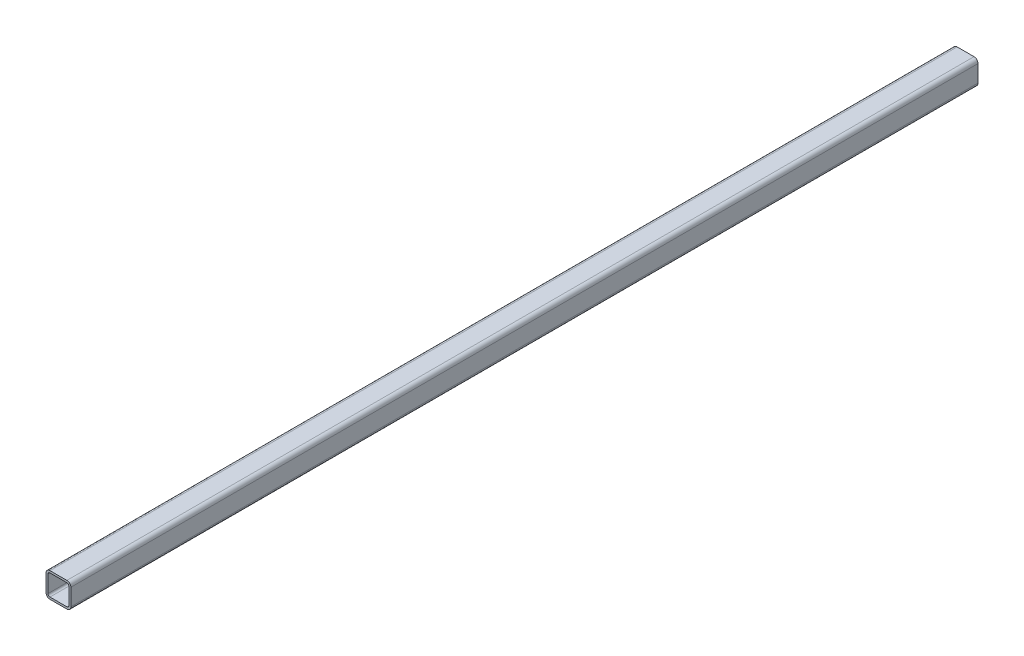
ISO-10303-21;
HEADER;
FILE_DESCRIPTION(('STEP AP214'),'2;1');
FILE_NAME('part.step','',(''),(''),'','','');
FILE_SCHEMA(('AUTOMOTIVE_DESIGN { 1 0 10303 214 1 1 1 1 }'));
ENDSEC;
DATA;
#1=APPLICATION_CONTEXT('core data for automotive mechanical design processes');
#2=APPLICATION_PROTOCOL_DEFINITION('international standard','automotive_design',2000,#1);
#3=PRODUCT_CONTEXT('',#1,'mechanical');
#4=PRODUCT('Part','Part','',(#3));
#5=PRODUCT_RELATED_PRODUCT_CATEGORY('part','',(#4));
#6=PRODUCT_DEFINITION_FORMATION('','',#4);
#7=PRODUCT_DEFINITION_CONTEXT('part definition',#1,'design');
#8=PRODUCT_DEFINITION('design','',#6,#7);
#9=PRODUCT_DEFINITION_SHAPE('','',#8);
#10=(LENGTH_UNIT() NAMED_UNIT(*) SI_UNIT(.MILLI.,.METRE.));
#11=(NAMED_UNIT(*) PLANE_ANGLE_UNIT() SI_UNIT($,.RADIAN.));
#12=(NAMED_UNIT(*) SI_UNIT($,.STERADIAN.) SOLID_ANGLE_UNIT());
#13=UNCERTAINTY_MEASURE_WITH_UNIT(LENGTH_MEASURE(1.E-05),#10,'distance_accuracy_value','');
#14=(GEOMETRIC_REPRESENTATION_CONTEXT(3) GLOBAL_UNCERTAINTY_ASSIGNED_CONTEXT((#13)) GLOBAL_UNIT_ASSIGNED_CONTEXT((#10,
#11,#12)) REPRESENTATION_CONTEXT('',''));
#15=CARTESIAN_POINT('',(0.,0.,0.));
#16=DIRECTION('',(0.,0.,1.));
#17=DIRECTION('',(1.,0.,0.));
#18=AXIS2_PLACEMENT_3D('',#15,#16,#17);
#19=CARTESIAN_POINT('',(933.6,923.6,-880.));
#20=DIRECTION('',(0.,0.,1.));
#21=DIRECTION('',(1.,0.,0.));
#22=AXIS2_PLACEMENT_3D('',#19,#20,#21);
#23=CYLINDRICAL_SURFACE('',#22,6.39999999999996);
#24=CARTESIAN_POINT('',(933.6,923.6,600.));
#25=DIRECTION('',(0.,0.,1.));
#26=DIRECTION('',(1.,0.,0.));
#27=AXIS2_PLACEMENT_3D('',#24,#25,#26);
#28=CIRCLE('',#27,6.39999999999996);
#29=CARTESIAN_POINT('',(940.,923.6,600.));
#30=VERTEX_POINT('',#29);
#31=CARTESIAN_POINT('',(933.6,930.,600.));
#32=VERTEX_POINT('',#31);
#33=EDGE_CURVE('E234',#30,#32,#28,.T.);
#34=ORIENTED_EDGE('',*,*,#33,.F.);
#35=DIRECTION('',(0.,0.,1.));
#36=VECTOR('',#35,1.);
#37=CARTESIAN_POINT('',(940.,923.6,-880.));
#38=LINE('',#37,#36);
#39=CARTESIAN_POINT('',(940.,923.6,-860.));
#40=VERTEX_POINT('',#39);
#41=EDGE_CURVE('E137',#30,#40,#38,.F.);
#42=ORIENTED_EDGE('',*,*,#41,.T.);
#43=CARTESIAN_POINT('',(933.6,923.6,-860.));
#44=DIRECTION('',(0.,0.,1.));
#45=DIRECTION('',(1.,0.,0.));
#46=AXIS2_PLACEMENT_3D('',#43,#44,#45);
#47=CIRCLE('',#46,6.39999999999996);
#48=CARTESIAN_POINT('',(933.6,930.,-860.));
#49=VERTEX_POINT('',#48);
#50=EDGE_CURVE('E251',#49,#40,#47,.F.);
#51=ORIENTED_EDGE('',*,*,#50,.F.);
#52=DIRECTION('',(0.,0.,-1.));
#53=VECTOR('',#52,1.);
#54=CARTESIAN_POINT('',(933.6,930.,-880.));
#55=LINE('',#54,#53);
#56=EDGE_CURVE('E208',#49,#32,#55,.F.);
#57=ORIENTED_EDGE('',*,*,#56,.T.);
#58=EDGE_LOOP('',(#34,#42,#51,#57));
#59=FACE_BOUND('',#58,.T.);
#60=ADVANCED_FACE('F19',(#59),#23,.T.);
#61=CARTESIAN_POINT('',(906.4,930.,-880.));
#62=DIRECTION('',(0.,-1.,0.));
#63=DIRECTION('',(0.,0.,-1.));
#64=AXIS2_PLACEMENT_3D('',#61,#62,#63);
#65=PLANE('',#64);
#66=DIRECTION('',(-1.,0.,0.));
#67=VECTOR('',#66,1.);
#68=CARTESIAN_POINT('',(-1180.,930.,-860.));
#69=LINE('',#68,#67);
#70=CARTESIAN_POINT('',(906.4,930.,-860.));
#71=VERTEX_POINT('',#70);
#72=EDGE_CURVE('E182',#71,#49,#69,.F.);
#73=ORIENTED_EDGE('',*,*,#72,.F.);
#74=DIRECTION('',(0.,0.,1.));
#75=VECTOR('',#74,1.);
#76=CARTESIAN_POINT('',(906.4,930.,-880.));
#77=LINE('',#76,#75);
#78=CARTESIAN_POINT('',(906.4,930.,600.));
#79=VERTEX_POINT('',#78);
#80=EDGE_CURVE('E206',#79,#71,#77,.F.);
#81=ORIENTED_EDGE('',*,*,#80,.F.);
#82=DIRECTION('',(1.,0.,0.));
#83=VECTOR('',#82,1.);
#84=CARTESIAN_POINT('',(1180.,930.,600.));
#85=LINE('',#84,#83);
#86=EDGE_CURVE('E233',#32,#79,#85,.F.);
#87=ORIENTED_EDGE('',*,*,#86,.F.);
#88=ORIENTED_EDGE('',*,*,#56,.F.);
#89=EDGE_LOOP('',(#73,#81,#87,#88));
#90=FACE_BOUND('',#89,.T.);
#91=ADVANCED_FACE('F270',(#90),#65,.F.);
#92=CARTESIAN_POINT('',(906.4,923.6,-880.));
#93=DIRECTION('',(0.,0.,1.));
#94=DIRECTION('',(1.,0.,0.));
#95=AXIS2_PLACEMENT_3D('',#92,#93,#94);
#96=CYLINDRICAL_SURFACE('',#95,6.39999999999996);
#97=CARTESIAN_POINT('',(906.4,923.6,600.));
#98=DIRECTION('',(0.,0.,1.));
#99=DIRECTION('',(1.,0.,0.));
#100=AXIS2_PLACEMENT_3D('',#97,#98,#99);
#101=CIRCLE('',#100,6.39999999999996);
#102=CARTESIAN_POINT('',(900.,923.6,600.));
#103=VERTEX_POINT('',#102);
#104=EDGE_CURVE('E230',#79,#103,#101,.T.);
#105=ORIENTED_EDGE('',*,*,#104,.F.);
#106=ORIENTED_EDGE('',*,*,#80,.T.);
#107=CARTESIAN_POINT('',(906.4,923.6,-860.));
#108=DIRECTION('',(0.,0.,1.));
#109=DIRECTION('',(1.,0.,0.));
#110=AXIS2_PLACEMENT_3D('',#107,#108,#109);
#111=CIRCLE('',#110,6.39999999999996);
#112=CARTESIAN_POINT('',(900.,923.6,-860.));
#113=VERTEX_POINT('',#112);
#114=EDGE_CURVE('E181',#113,#71,#111,.F.);
#115=ORIENTED_EDGE('',*,*,#114,.F.);
#116=DIRECTION('',(0.,0.,-1.));
#117=VECTOR('',#116,1.);
#118=CARTESIAN_POINT('',(900.,923.6,-880.));
#119=LINE('',#118,#117);
#120=EDGE_CURVE('E204',#113,#103,#119,.F.);
#121=ORIENTED_EDGE('',*,*,#120,.T.);
#122=EDGE_LOOP('',(#105,#106,#115,#121));
#123=FACE_BOUND('',#122,.T.);
#124=ADVANCED_FACE('F265',(#123),#96,.T.);
#125=CARTESIAN_POINT('',(900.,923.6,-880.));
#126=DIRECTION('',(1.,0.,0.));
#127=DIRECTION('',(0.,0.,-1.));
#128=AXIS2_PLACEMENT_3D('',#125,#126,#127);
#129=PLANE('',#128);
#130=DIRECTION('',(0.,1.,0.));
#131=VECTOR('',#130,1.);
#132=CARTESIAN_POINT('',(900.,923.6,-860.));
#133=LINE('',#132,#131);
#134=CARTESIAN_POINT('',(900.,896.4,-860.));
#135=VERTEX_POINT('',#134);
#136=EDGE_CURVE('E177',#135,#113,#133,.T.);
#137=ORIENTED_EDGE('',*,*,#136,.F.);
#138=DIRECTION('',(0.,0.,1.));
#139=VECTOR('',#138,1.);
#140=CARTESIAN_POINT('',(900.,896.4,-880.));
#141=LINE('',#140,#139);
#142=CARTESIAN_POINT('',(900.,896.4,600.));
#143=VERTEX_POINT('',#142);
#144=EDGE_CURVE('E202',#143,#135,#141,.F.);
#145=ORIENTED_EDGE('',*,*,#144,.F.);
#146=DIRECTION('',(0.,-1.,0.));
#147=VECTOR('',#146,1.);
#148=CARTESIAN_POINT('',(900.,923.6,600.));
#149=LINE('',#148,#147);
#150=EDGE_CURVE('E229',#103,#143,#149,.T.);
#151=ORIENTED_EDGE('',*,*,#150,.F.);
#152=ORIENTED_EDGE('',*,*,#120,.F.);
#153=EDGE_LOOP('',(#137,#145,#151,#152));
#154=FACE_BOUND('',#153,.T.);
#155=ADVANCED_FACE('F261',(#154),#129,.F.);
#156=CARTESIAN_POINT('',(906.4,896.4,-880.));
#157=DIRECTION('',(0.,0.,1.));
#158=DIRECTION('',(1.,0.,0.));
#159=AXIS2_PLACEMENT_3D('',#156,#157,#158);
#160=CYLINDRICAL_SURFACE('',#159,6.40000000000007);
#161=CARTESIAN_POINT('',(906.4,896.4,600.));
#162=DIRECTION('',(0.,0.,1.));
#163=DIRECTION('',(1.,0.,0.));
#164=AXIS2_PLACEMENT_3D('',#161,#162,#163);
#165=CIRCLE('',#164,6.40000000000007);
#166=CARTESIAN_POINT('',(906.4,890.,600.));
#167=VERTEX_POINT('',#166);
#168=EDGE_CURVE('E226',#143,#167,#165,.T.);
#169=ORIENTED_EDGE('',*,*,#168,.F.);
#170=ORIENTED_EDGE('',*,*,#144,.T.);
#171=CARTESIAN_POINT('',(906.4,896.4,-860.));
#172=DIRECTION('',(0.,0.,1.));
#173=DIRECTION('',(1.,0.,0.));
#174=AXIS2_PLACEMENT_3D('',#171,#172,#173);
#175=CIRCLE('',#174,6.40000000000007);
#176=CARTESIAN_POINT('',(906.4,890.,-860.));
#177=VERTEX_POINT('',#176);
#178=EDGE_CURVE('E146',#177,#135,#175,.F.);
#179=ORIENTED_EDGE('',*,*,#178,.F.);
#180=DIRECTION('',(0.,0.,1.));
#181=VECTOR('',#180,1.);
#182=CARTESIAN_POINT('',(906.4,890.,-880.));
#183=LINE('',#182,#181);
#184=EDGE_CURVE('E138',#177,#167,#183,.T.);
#185=ORIENTED_EDGE('',*,*,#184,.T.);
#186=EDGE_LOOP('',(#169,#170,#179,#185));
#187=FACE_BOUND('',#186,.T.);
#188=ADVANCED_FACE('F257',(#187),#160,.T.);
#189=CARTESIAN_POINT('',(933.6,890.,-880.));
#190=DIRECTION('',(0.,1.,0.));
#191=DIRECTION('',(0.,0.,1.));
#192=AXIS2_PLACEMENT_3D('',#189,#190,#191);
#193=PLANE('',#192);
#194=DIRECTION('',(-1.,0.,0.));
#195=VECTOR('',#194,1.);
#196=CARTESIAN_POINT('',(-1180.,890.,-860.));
#197=LINE('',#196,#195);
#198=CARTESIAN_POINT('',(933.6,890.,-860.));
#199=VERTEX_POINT('',#198);
#200=EDGE_CURVE('E141',#199,#177,#197,.T.);
#201=ORIENTED_EDGE('',*,*,#200,.F.);
#202=DIRECTION('',(0.,0.,1.));
#203=VECTOR('',#202,1.);
#204=CARTESIAN_POINT('',(933.6,890.,-880.));
#205=LINE('',#204,#203);
#206=CARTESIAN_POINT('',(933.6,890.,600.));
#207=VERTEX_POINT('',#206);
#208=EDGE_CURVE('E129',#207,#199,#205,.F.);
#209=ORIENTED_EDGE('',*,*,#208,.F.);
#210=DIRECTION('',(1.,0.,0.));
#211=VECTOR('',#210,1.);
#212=CARTESIAN_POINT('',(1180.,890.,600.));
#213=LINE('',#212,#211);
#214=EDGE_CURVE('E225',#167,#207,#213,.T.);
#215=ORIENTED_EDGE('',*,*,#214,.F.);
#216=ORIENTED_EDGE('',*,*,#184,.F.);
#217=EDGE_LOOP('',(#201,#209,#215,#216));
#218=FACE_BOUND('',#217,.T.);
#219=ADVANCED_FACE('F142',(#218),#193,.F.);
#220=CARTESIAN_POINT('',(933.6,896.4,-880.));
#221=DIRECTION('',(0.,0.,1.));
#222=DIRECTION('',(1.,0.,0.));
#223=AXIS2_PLACEMENT_3D('',#220,#221,#222);
#224=CYLINDRICAL_SURFACE('',#223,6.39999999999996);
#225=CARTESIAN_POINT('',(933.6,896.4,600.));
#226=DIRECTION('',(0.,0.,1.));
#227=DIRECTION('',(1.,0.,0.));
#228=AXIS2_PLACEMENT_3D('',#225,#226,#227);
#229=CIRCLE('',#228,6.39999999999996);
#230=CARTESIAN_POINT('',(940.,896.4,600.));
#231=VERTEX_POINT('',#230);
#232=EDGE_CURVE('E133',#207,#231,#229,.T.);
#233=ORIENTED_EDGE('',*,*,#232,.F.);
#234=ORIENTED_EDGE('',*,*,#208,.T.);
#235=CARTESIAN_POINT('',(933.6,896.4,-860.));
#236=DIRECTION('',(0.,0.,1.));
#237=DIRECTION('',(1.,0.,0.));
#238=AXIS2_PLACEMENT_3D('',#235,#236,#237);
#239=CIRCLE('',#238,6.39999999999996);
#240=CARTESIAN_POINT('',(940.,896.4,-860.));
#241=VERTEX_POINT('',#240);
#242=EDGE_CURVE('E22',#241,#199,#239,.F.);
#243=ORIENTED_EDGE('',*,*,#242,.F.);
#244=DIRECTION('',(0.,0.,1.));
#245=VECTOR('',#244,1.);
#246=CARTESIAN_POINT('',(940.,896.4,-880.));
#247=LINE('',#246,#245);
#248=EDGE_CURVE('E195',#241,#231,#247,.T.);
#249=ORIENTED_EDGE('',*,*,#248,.T.);
#250=EDGE_LOOP('',(#233,#234,#243,#249));
#251=FACE_BOUND('',#250,.T.);
#252=ADVANCED_FACE('F131',(#251),#224,.T.);
#253=CARTESIAN_POINT('',(940.,896.4,-880.));
#254=DIRECTION('',(-1.,0.,0.));
#255=DIRECTION('',(0.,0.,1.));
#256=AXIS2_PLACEMENT_3D('',#253,#254,#255);
#257=PLANE('',#256);
#258=DIRECTION('',(0.,1.,0.));
#259=VECTOR('',#258,1.);
#260=CARTESIAN_POINT('',(940.,923.6,-860.));
#261=LINE('',#260,#259);
#262=EDGE_CURVE('E152',#40,#241,#261,.F.);
#263=ORIENTED_EDGE('',*,*,#262,.F.);
#264=ORIENTED_EDGE('',*,*,#41,.F.);
#265=DIRECTION('',(0.,-1.,0.));
#266=VECTOR('',#265,1.);
#267=CARTESIAN_POINT('',(940.,923.6,600.));
#268=LINE('',#267,#266);
#269=EDGE_CURVE('E223',#231,#30,#268,.F.);
#270=ORIENTED_EDGE('',*,*,#269,.F.);
#271=ORIENTED_EDGE('',*,*,#248,.F.);
#272=EDGE_LOOP('',(#263,#264,#270,#271));
#273=FACE_BOUND('',#272,.T.);
#274=ADVANCED_FACE('F277',(#273),#257,.F.);
#275=CARTESIAN_POINT('',(906.4,896.4,-880.));
#276=DIRECTION('',(0.,0.,1.));
#277=DIRECTION('',(1.,0.,0.));
#278=AXIS2_PLACEMENT_3D('',#275,#276,#277);
#279=CYLINDRICAL_SURFACE('',#278,3.19999999999998);
#280=DIRECTION('',(0.,0.,1.));
#281=VECTOR('',#280,1.);
#282=CARTESIAN_POINT('',(906.4,893.2,-880.));
#283=LINE('',#282,#281);
#284=CARTESIAN_POINT('',(906.4,893.2,-860.));
#285=VERTEX_POINT('',#284);
#286=CARTESIAN_POINT('',(906.4,893.2,600.));
#287=VERTEX_POINT('',#286);
#288=EDGE_CURVE('E154',#285,#287,#283,.T.);
#289=ORIENTED_EDGE('',*,*,#288,.F.);
#290=CARTESIAN_POINT('',(906.4,896.4,-860.));
#291=DIRECTION('',(0.,0.,1.));
#292=DIRECTION('',(1.,0.,0.));
#293=AXIS2_PLACEMENT_3D('',#290,#291,#292);
#294=CIRCLE('',#293,3.19999999999998);
#295=CARTESIAN_POINT('',(903.2,896.4,-860.));
#296=VERTEX_POINT('',#295);
#297=EDGE_CURVE('E247',#296,#285,#294,.T.);
#298=ORIENTED_EDGE('',*,*,#297,.F.);
#299=DIRECTION('',(0.,0.,-1.));
#300=VECTOR('',#299,1.);
#301=CARTESIAN_POINT('',(903.2,896.4,-880.));
#302=LINE('',#301,#300);
#303=CARTESIAN_POINT('',(903.2,896.4,600.));
#304=VERTEX_POINT('',#303);
#305=EDGE_CURVE('E168',#304,#296,#302,.T.);
#306=ORIENTED_EDGE('',*,*,#305,.F.);
#307=CARTESIAN_POINT('',(906.4,896.4,600.));
#308=DIRECTION('',(0.,0.,1.));
#309=DIRECTION('',(1.,0.,0.));
#310=AXIS2_PLACEMENT_3D('',#307,#308,#309);
#311=CIRCLE('',#310,3.19999999999998);
#312=EDGE_CURVE('E220',#287,#304,#311,.F.);
#313=ORIENTED_EDGE('',*,*,#312,.F.);
#314=EDGE_LOOP('',(#289,#298,#306,#313));
#315=FACE_BOUND('',#314,.T.);
#316=ADVANCED_FACE('F316',(#315),#279,.F.);
#317=CARTESIAN_POINT('',(903.2,923.6,-880.));
#318=DIRECTION('',(1.,0.,0.));
#319=DIRECTION('',(0.,0.,-1.));
#320=AXIS2_PLACEMENT_3D('',#317,#318,#319);
#321=PLANE('',#320);
#322=DIRECTION('',(0.,0.,1.));
#323=VECTOR('',#322,1.);
#324=CARTESIAN_POINT('',(903.2,923.6,-880.));
#325=LINE('',#324,#323);
#326=CARTESIAN_POINT('',(903.2,923.6,-860.));
#327=VERTEX_POINT('',#326);
#328=CARTESIAN_POINT('',(903.2,923.6,600.));
#329=VERTEX_POINT('',#328);
#330=EDGE_CURVE('E153',#327,#329,#325,.T.);
#331=ORIENTED_EDGE('',*,*,#330,.T.);
#332=DIRECTION('',(0.,-1.,0.));
#333=VECTOR('',#332,1.);
#334=CARTESIAN_POINT('',(903.2,923.6,600.));
#335=LINE('',#334,#333);
#336=EDGE_CURVE('E219',#304,#329,#335,.F.);
#337=ORIENTED_EDGE('',*,*,#336,.F.);
#338=ORIENTED_EDGE('',*,*,#305,.T.);
#339=DIRECTION('',(0.,1.,0.));
#340=VECTOR('',#339,1.);
#341=CARTESIAN_POINT('',(903.2,923.6,-860.));
#342=LINE('',#341,#340);
#343=EDGE_CURVE('E250',#327,#296,#342,.F.);
#344=ORIENTED_EDGE('',*,*,#343,.F.);
#345=EDGE_LOOP('',(#331,#337,#338,#344));
#346=FACE_BOUND('',#345,.T.);
#347=ADVANCED_FACE('F317',(#346),#321,.T.);
#348=CARTESIAN_POINT('',(936.8,896.4,-880.));
#349=DIRECTION('',(-1.,0.,0.));
#350=DIRECTION('',(0.,0.,1.));
#351=AXIS2_PLACEMENT_3D('',#348,#349,#350);
#352=PLANE('',#351);
#353=DIRECTION('',(0.,0.,1.));
#354=VECTOR('',#353,1.);
#355=CARTESIAN_POINT('',(936.8,896.4,-880.));
#356=LINE('',#355,#354);
#357=CARTESIAN_POINT('',(936.8,896.4,-860.));
#358=VERTEX_POINT('',#357);
#359=CARTESIAN_POINT('',(936.8,896.4,600.));
#360=VERTEX_POINT('',#359);
#361=EDGE_CURVE('E188',#358,#360,#356,.T.);
#362=ORIENTED_EDGE('',*,*,#361,.T.);
#363=DIRECTION('',(0.,-1.,0.));
#364=VECTOR('',#363,1.);
#365=CARTESIAN_POINT('',(936.8,923.6,600.));
#366=LINE('',#365,#364);
#367=CARTESIAN_POINT('',(936.8,923.6,600.));
#368=VERTEX_POINT('',#367);
#369=EDGE_CURVE('E214',#368,#360,#366,.T.);
#370=ORIENTED_EDGE('',*,*,#369,.F.);
#371=DIRECTION('',(0.,0.,1.));
#372=VECTOR('',#371,1.);
#373=CARTESIAN_POINT('',(936.8,923.6,-880.));
#374=LINE('',#373,#372);
#375=CARTESIAN_POINT('',(936.8,923.6,-860.));
#376=VERTEX_POINT('',#375);
#377=EDGE_CURVE('E166',#368,#376,#374,.F.);
#378=ORIENTED_EDGE('',*,*,#377,.T.);
#379=DIRECTION('',(0.,1.,0.));
#380=VECTOR('',#379,1.);
#381=CARTESIAN_POINT('',(936.8,923.6,-860.));
#382=LINE('',#381,#380);
#383=EDGE_CURVE('E242',#358,#376,#382,.T.);
#384=ORIENTED_EDGE('',*,*,#383,.F.);
#385=EDGE_LOOP('',(#362,#370,#378,#384));
#386=FACE_BOUND('',#385,.T.);
#387=ADVANCED_FACE('F323',(#386),#352,.T.);
#388=CARTESIAN_POINT('',(933.6,896.4,-880.));
#389=DIRECTION('',(0.,0.,1.));
#390=DIRECTION('',(1.,0.,0.));
#391=AXIS2_PLACEMENT_3D('',#388,#389,#390);
#392=CYLINDRICAL_SURFACE('',#391,3.19999999999998);
#393=ORIENTED_EDGE('',*,*,#361,.F.);
#394=CARTESIAN_POINT('',(933.6,896.4,-860.));
#395=DIRECTION('',(0.,0.,1.));
#396=DIRECTION('',(1.,0.,0.));
#397=AXIS2_PLACEMENT_3D('',#394,#395,#396);
#398=CIRCLE('',#397,3.19999999999998);
#399=CARTESIAN_POINT('',(933.6,893.2,-860.));
#400=VERTEX_POINT('',#399);
#401=EDGE_CURVE('E243',#400,#358,#398,.T.);
#402=ORIENTED_EDGE('',*,*,#401,.F.);
#403=DIRECTION('',(0.,0.,1.));
#404=VECTOR('',#403,1.);
#405=CARTESIAN_POINT('',(933.6,893.2,-880.));
#406=LINE('',#405,#404);
#407=CARTESIAN_POINT('',(933.6,893.2,600.));
#408=VERTEX_POINT('',#407);
#409=EDGE_CURVE('E161',#408,#400,#406,.F.);
#410=ORIENTED_EDGE('',*,*,#409,.F.);
#411=CARTESIAN_POINT('',(933.6,896.4,600.));
#412=DIRECTION('',(0.,0.,1.));
#413=DIRECTION('',(1.,0.,0.));
#414=AXIS2_PLACEMENT_3D('',#411,#412,#413);
#415=CIRCLE('',#414,3.19999999999998);
#416=EDGE_CURVE('E210',#360,#408,#415,.F.);
#417=ORIENTED_EDGE('',*,*,#416,.F.);
#418=EDGE_LOOP('',(#393,#402,#410,#417));
#419=FACE_BOUND('',#418,.T.);
#420=ADVANCED_FACE('F312',(#419),#392,.F.);
#421=CARTESIAN_POINT('',(933.6,893.2,-880.));
#422=DIRECTION('',(0.,1.,0.));
#423=DIRECTION('',(0.,0.,1.));
#424=AXIS2_PLACEMENT_3D('',#421,#422,#423);
#425=PLANE('',#424);
#426=ORIENTED_EDGE('',*,*,#288,.T.);
#427=DIRECTION('',(1.,0.,0.));
#428=VECTOR('',#427,1.);
#429=CARTESIAN_POINT('',(1180.,893.2,600.));
#430=LINE('',#429,#428);
#431=EDGE_CURVE('E213',#408,#287,#430,.F.);
#432=ORIENTED_EDGE('',*,*,#431,.F.);
#433=ORIENTED_EDGE('',*,*,#409,.T.);
#434=DIRECTION('',(-1.,0.,0.));
#435=VECTOR('',#434,1.);
#436=CARTESIAN_POINT('',(-1180.,893.2,-860.));
#437=LINE('',#436,#435);
#438=EDGE_CURVE('E246',#285,#400,#437,.F.);
#439=ORIENTED_EDGE('',*,*,#438,.F.);
#440=EDGE_LOOP('',(#426,#432,#433,#439));
#441=FACE_BOUND('',#440,.T.);
#442=ADVANCED_FACE('F307',(#441),#425,.T.);
#443=CARTESIAN_POINT('',(906.4,923.6,-880.));
#444=DIRECTION('',(0.,0.,1.));
#445=DIRECTION('',(1.,0.,0.));
#446=AXIS2_PLACEMENT_3D('',#443,#444,#445);
#447=CYLINDRICAL_SURFACE('',#446,3.19999999999998);
#448=ORIENTED_EDGE('',*,*,#330,.F.);
#449=CARTESIAN_POINT('',(906.4,923.6,-860.));
#450=DIRECTION('',(0.,0.,1.));
#451=DIRECTION('',(1.,0.,0.));
#452=AXIS2_PLACEMENT_3D('',#449,#450,#451);
#453=CIRCLE('',#452,3.19999999999998);
#454=CARTESIAN_POINT('',(906.4,926.8,-860.));
#455=VERTEX_POINT('',#454);
#456=EDGE_CURVE('E239',#455,#327,#453,.T.);
#457=ORIENTED_EDGE('',*,*,#456,.F.);
#458=DIRECTION('',(0.,0.,-1.));
#459=VECTOR('',#458,1.);
#460=CARTESIAN_POINT('',(906.4,926.8,-880.));
#461=LINE('',#460,#459);
#462=CARTESIAN_POINT('',(906.4,926.8,600.));
#463=VERTEX_POINT('',#462);
#464=EDGE_CURVE('E288',#463,#455,#461,.T.);
#465=ORIENTED_EDGE('',*,*,#464,.F.);
#466=CARTESIAN_POINT('',(906.4,923.6,600.));
#467=DIRECTION('',(0.,0.,1.));
#468=DIRECTION('',(1.,0.,0.));
#469=AXIS2_PLACEMENT_3D('',#466,#467,#468);
#470=CIRCLE('',#469,3.19999999999998);
#471=EDGE_CURVE('E216',#329,#463,#470,.F.);
#472=ORIENTED_EDGE('',*,*,#471,.F.);
#473=EDGE_LOOP('',(#448,#457,#465,#472));
#474=FACE_BOUND('',#473,.T.);
#475=ADVANCED_FACE('F344',(#474),#447,.F.);
#476=CARTESIAN_POINT('',(-1180.,923.6,-860.));
#477=DIRECTION('',(0.,0.,-1.));
#478=DIRECTION('',(-1.,0.,0.));
#479=AXIS2_PLACEMENT_3D('',#476,#477,#478);
#480=PLANE('',#479);
#481=DIRECTION('',(1.,0.,0.));
#482=VECTOR('',#481,1.);
#483=CARTESIAN_POINT('',(906.4,926.8,-860.));
#484=LINE('',#483,#482);
#485=CARTESIAN_POINT('',(933.6,926.8,-860.));
#486=VERTEX_POINT('',#485);
#487=EDGE_CURVE('E284',#455,#486,#484,.T.);
#488=ORIENTED_EDGE('',*,*,#487,.F.);
#489=ORIENTED_EDGE('',*,*,#456,.T.);
#490=ORIENTED_EDGE('',*,*,#343,.T.);
#491=ORIENTED_EDGE('',*,*,#297,.T.);
#492=ORIENTED_EDGE('',*,*,#438,.T.);
#493=ORIENTED_EDGE('',*,*,#401,.T.);
#494=ORIENTED_EDGE('',*,*,#383,.T.);
#495=CARTESIAN_POINT('',(933.6,923.6,-860.));
#496=DIRECTION('',(0.,0.,1.));
#497=DIRECTION('',(1.,0.,0.));
#498=AXIS2_PLACEMENT_3D('',#495,#496,#497);
#499=CIRCLE('',#498,3.19999999999998);
#500=EDGE_CURVE('E237',#376,#486,#499,.T.);
#501=ORIENTED_EDGE('',*,*,#500,.T.);
#502=EDGE_LOOP('',(#488,#489,#490,#491,#492,#493,#494,#501));
#503=FACE_BOUND('',#502,.T.);
#504=ORIENTED_EDGE('',*,*,#50,.T.);
#505=ORIENTED_EDGE('',*,*,#262,.T.);
#506=ORIENTED_EDGE('',*,*,#242,.T.);
#507=ORIENTED_EDGE('',*,*,#200,.T.);
#508=ORIENTED_EDGE('',*,*,#178,.T.);
#509=ORIENTED_EDGE('',*,*,#136,.T.);
#510=ORIENTED_EDGE('',*,*,#114,.T.);
#511=ORIENTED_EDGE('',*,*,#72,.T.);
#512=EDGE_LOOP('',(#504,#505,#506,#507,#508,#509,#510,#511));
#513=FACE_BOUND('',#512,.T.);
#514=ADVANCED_FACE('F150',(#503,#513),#480,.T.);
#515=CARTESIAN_POINT('',(933.6,923.6,-880.));
#516=DIRECTION('',(0.,0.,1.));
#517=DIRECTION('',(1.,0.,0.));
#518=AXIS2_PLACEMENT_3D('',#515,#516,#517);
#519=CYLINDRICAL_SURFACE('',#518,3.19999999999998);
#520=DIRECTION('',(0.,0.,-1.));
#521=VECTOR('',#520,1.);
#522=CARTESIAN_POINT('',(933.600000000001,926.8,-880.));
#523=LINE('',#522,#521);
#524=CARTESIAN_POINT('',(933.6,926.8,600.));
#525=VERTEX_POINT('',#524);
#526=EDGE_CURVE('E28',#486,#525,#523,.F.);
#527=ORIENTED_EDGE('',*,*,#526,.F.);
#528=ORIENTED_EDGE('',*,*,#500,.F.);
#529=ORIENTED_EDGE('',*,*,#377,.F.);
#530=CARTESIAN_POINT('',(933.6,923.6,600.));
#531=DIRECTION('',(0.,0.,1.));
#532=DIRECTION('',(1.,0.,0.));
#533=AXIS2_PLACEMENT_3D('',#530,#531,#532);
#534=CIRCLE('',#533,3.19999999999998);
#535=EDGE_CURVE('E37',#525,#368,#534,.F.);
#536=ORIENTED_EDGE('',*,*,#535,.F.);
#537=EDGE_LOOP('',(#527,#528,#529,#536));
#538=FACE_BOUND('',#537,.T.);
#539=ADVANCED_FACE('F322',(#538),#519,.F.);
#540=CARTESIAN_POINT('',(1180.,923.6,600.));
#541=DIRECTION('',(0.,0.,1.));
#542=DIRECTION('',(0.,-1.,0.));
#543=AXIS2_PLACEMENT_3D('',#540,#541,#542);
#544=PLANE('',#543);
#545=ORIENTED_EDGE('',*,*,#416,.T.);
#546=ORIENTED_EDGE('',*,*,#431,.T.);
#547=ORIENTED_EDGE('',*,*,#312,.T.);
#548=ORIENTED_EDGE('',*,*,#336,.T.);
#549=ORIENTED_EDGE('',*,*,#471,.T.);
#550=DIRECTION('',(1.,0.,0.));
#551=VECTOR('',#550,1.);
#552=CARTESIAN_POINT('',(906.4,926.8,600.));
#553=LINE('',#552,#551);
#554=EDGE_CURVE('E12',#525,#463,#553,.F.);
#555=ORIENTED_EDGE('',*,*,#554,.F.);
#556=ORIENTED_EDGE('',*,*,#535,.T.);
#557=ORIENTED_EDGE('',*,*,#369,.T.);
#558=EDGE_LOOP('',(#545,#546,#547,#548,#549,#555,#556,#557));
#559=FACE_BOUND('',#558,.T.);
#560=ORIENTED_EDGE('',*,*,#232,.T.);
#561=ORIENTED_EDGE('',*,*,#269,.T.);
#562=ORIENTED_EDGE('',*,*,#33,.T.);
#563=ORIENTED_EDGE('',*,*,#86,.T.);
#564=ORIENTED_EDGE('',*,*,#104,.T.);
#565=ORIENTED_EDGE('',*,*,#150,.T.);
#566=ORIENTED_EDGE('',*,*,#168,.T.);
#567=ORIENTED_EDGE('',*,*,#214,.T.);
#568=EDGE_LOOP('',(#560,#561,#562,#563,#564,#565,#566,#567));
#569=FACE_BOUND('',#568,.T.);
#570=ADVANCED_FACE('F304',(#559,#569),#544,.T.);
#571=CARTESIAN_POINT('',(906.4,926.8,-880.));
#572=DIRECTION('',(0.,-1.,0.));
#573=DIRECTION('',(0.,0.,-1.));
#574=AXIS2_PLACEMENT_3D('',#571,#572,#573);
#575=PLANE('',#574);
#576=ORIENTED_EDGE('',*,*,#526,.T.);
#577=ORIENTED_EDGE('',*,*,#554,.T.);
#578=ORIENTED_EDGE('',*,*,#464,.T.);
#579=ORIENTED_EDGE('',*,*,#487,.T.);
#580=EDGE_LOOP('',(#576,#577,#578,#579));
#581=FACE_BOUND('',#580,.T.);
#582=ADVANCED_FACE('F320',(#581),#575,.T.);
#583=CLOSED_SHELL('',(#60,#91,#124,#155,#188,#219,#252,#274,#316,#347,#387,#420,#442,#475,#514,
#539,#570,#582));
#584=MANIFOLD_SOLID_BREP('B1',#583);
#585=ADVANCED_BREP_SHAPE_REPRESENTATION('',(#18,#584),#14);
#586=SHAPE_DEFINITION_REPRESENTATION(#9,#585);
ENDSEC;
END-ISO-10303-21;
